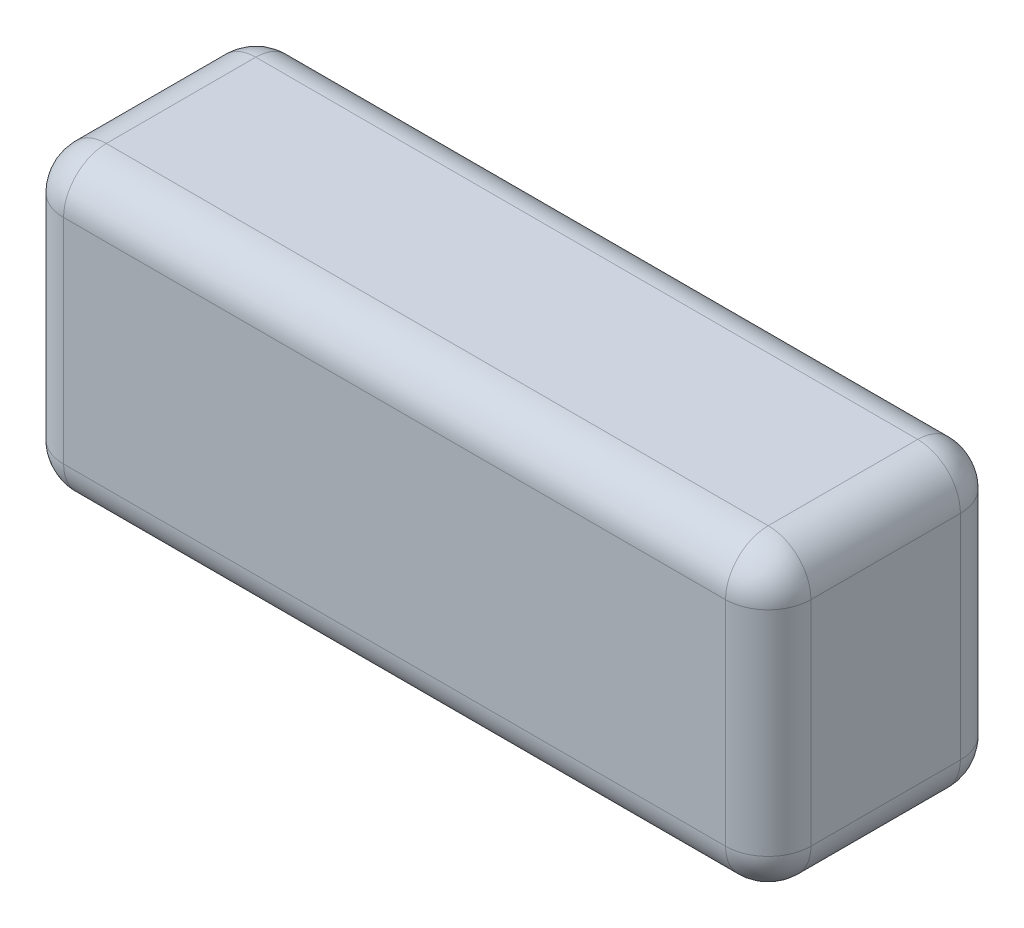
ISO-10303-21;
HEADER;
FILE_DESCRIPTION(('STEP AP214'),'2;1');
FILE_NAME('part.step','',(''),(''),'','','');
FILE_SCHEMA(('AUTOMOTIVE_DESIGN { 1 0 10303 214 1 1 1 1 }'));
ENDSEC;
DATA;
#1=APPLICATION_CONTEXT('core data for automotive mechanical design processes');
#2=APPLICATION_PROTOCOL_DEFINITION('international standard','automotive_design',2000,#1);
#3=PRODUCT_CONTEXT('',#1,'mechanical');
#4=PRODUCT('Part','Part','',(#3));
#5=PRODUCT_RELATED_PRODUCT_CATEGORY('part','',(#4));
#6=PRODUCT_DEFINITION_FORMATION('','',#4);
#7=PRODUCT_DEFINITION_CONTEXT('part definition',#1,'design');
#8=PRODUCT_DEFINITION('design','',#6,#7);
#9=PRODUCT_DEFINITION_SHAPE('','',#8);
#10=(LENGTH_UNIT() NAMED_UNIT(*) SI_UNIT(.MILLI.,.METRE.));
#11=(NAMED_UNIT(*) PLANE_ANGLE_UNIT() SI_UNIT($,.RADIAN.));
#12=(NAMED_UNIT(*) SI_UNIT($,.STERADIAN.) SOLID_ANGLE_UNIT());
#13=UNCERTAINTY_MEASURE_WITH_UNIT(LENGTH_MEASURE(1.E-05),#10,'distance_accuracy_value','');
#14=(GEOMETRIC_REPRESENTATION_CONTEXT(3) GLOBAL_UNCERTAINTY_ASSIGNED_CONTEXT((#13)) GLOBAL_UNIT_ASSIGNED_CONTEXT((#10,
#11,#12)) REPRESENTATION_CONTEXT('',''));
#15=CARTESIAN_POINT('',(0.,0.,0.));
#16=DIRECTION('',(0.,0.,1.));
#17=DIRECTION('',(1.,0.,0.));
#18=AXIS2_PLACEMENT_3D('',#15,#16,#17);
#19=CARTESIAN_POINT('',(70.,56.,-22.));
#20=DIRECTION('',(-1.,0.,0.));
#21=DIRECTION('',(0.,0.,1.));
#22=AXIS2_PLACEMENT_3D('',#19,#20,#21);
#23=PLANE('',#22);
#24=DIRECTION('',(0.,0.,-1.));
#25=VECTOR('',#24,1.);
#26=CARTESIAN_POINT('',(70.,48.,22.));
#27=LINE('',#26,#25);
#28=CARTESIAN_POINT('',(70.,48.,-14.));
#29=VERTEX_POINT('',#28);
#30=CARTESIAN_POINT('',(70.,48.,14.));
#31=VERTEX_POINT('',#30);
#32=EDGE_CURVE('E57',#29,#31,#27,.F.);
#33=ORIENTED_EDGE('',*,*,#32,.T.);
#34=DIRECTION('',(0.,-1.,0.));
#35=VECTOR('',#34,1.);
#36=CARTESIAN_POINT('',(70.,56.,14.));
#37=LINE('',#36,#35);
#38=CARTESIAN_POINT('',(70.,8.,14.));
#39=VERTEX_POINT('',#38);
#40=EDGE_CURVE('E50',#31,#39,#37,.T.);
#41=ORIENTED_EDGE('',*,*,#40,.T.);
#42=DIRECTION('',(0.,0.,-1.));
#43=VECTOR('',#42,1.);
#44=CARTESIAN_POINT('',(70.,8.,-22.));
#45=LINE('',#44,#43);
#46=CARTESIAN_POINT('',(70.,8.,-14.));
#47=VERTEX_POINT('',#46);
#48=EDGE_CURVE('E227',#39,#47,#45,.T.);
#49=ORIENTED_EDGE('',*,*,#48,.T.);
#50=DIRECTION('',(0.,-1.,0.));
#51=VECTOR('',#50,1.);
#52=CARTESIAN_POINT('',(70.,56.,-14.));
#53=LINE('',#52,#51);
#54=EDGE_CURVE('E62',#47,#29,#53,.F.);
#55=ORIENTED_EDGE('',*,*,#54,.T.);
#56=EDGE_LOOP('',(#33,#41,#49,#55));
#57=FACE_BOUND('',#56,.T.);
#58=ADVANCED_FACE('F41',(#57),#23,.F.);
#59=CARTESIAN_POINT('',(-70.,56.,-22.));
#60=DIRECTION('',(0.,0.,1.));
#61=DIRECTION('',(1.,0.,0.));
#62=AXIS2_PLACEMENT_3D('',#59,#60,#61);
#63=PLANE('',#62);
#64=CARTESIAN_POINT('',(0.,28.,-22.));
#65=DIRECTION('',(0.,0.,1.));
#66=DIRECTION('',(1.,0.,0.));
#67=AXIS2_PLACEMENT_3D('',#64,#65,#66);
#68=CIRCLE('',#67,0.907650606218853);
#69=CARTESIAN_POINT('',(0.907650606218874,28.,-22.));
#70=VERTEX_POINT('',#69);
#71=EDGE_CURVE('E11',#70,#70,#68,.F.);
#72=ORIENTED_EDGE('',*,*,#71,.F.);
#73=EDGE_LOOP('',(#72));
#74=FACE_BOUND('',#73,.T.);
#75=DIRECTION('',(-1.,0.,0.));
#76=VECTOR('',#75,1.);
#77=CARTESIAN_POINT('',(-70.,8.,-22.));
#78=LINE('',#77,#76);
#79=CARTESIAN_POINT('',(62.0000000000001,8.,-22.));
#80=VERTEX_POINT('',#79);
#81=CARTESIAN_POINT('',(-62.,8.,-22.));
#82=VERTEX_POINT('',#81);
#83=EDGE_CURVE('E204',#80,#82,#78,.T.);
#84=ORIENTED_EDGE('',*,*,#83,.T.);
#85=DIRECTION('',(0.,-1.,0.));
#86=VECTOR('',#85,1.);
#87=CARTESIAN_POINT('',(-62.,56.,-22.));
#88=LINE('',#87,#86);
#89=CARTESIAN_POINT('',(-62.,48.,-22.));
#90=VERTEX_POINT('',#89);
#91=EDGE_CURVE('E211',#82,#90,#88,.F.);
#92=ORIENTED_EDGE('',*,*,#91,.T.);
#93=DIRECTION('',(-1.,0.,0.));
#94=VECTOR('',#93,1.);
#95=CARTESIAN_POINT('',(70.,48.,-22.));
#96=LINE('',#95,#94);
#97=CARTESIAN_POINT('',(62.0000000000001,48.,-22.));
#98=VERTEX_POINT('',#97);
#99=EDGE_CURVE('E207',#90,#98,#96,.F.);
#100=ORIENTED_EDGE('',*,*,#99,.T.);
#101=DIRECTION('',(0.,-1.,0.));
#102=VECTOR('',#101,1.);
#103=CARTESIAN_POINT('',(62.0000000000001,56.,-22.));
#104=LINE('',#103,#102);
#105=EDGE_CURVE('E201',#98,#80,#104,.T.);
#106=ORIENTED_EDGE('',*,*,#105,.T.);
#107=EDGE_LOOP('',(#84,#92,#100,#106));
#108=FACE_BOUND('',#107,.T.);
#109=ADVANCED_FACE('F374',(#74,#108),#63,.F.);
#110=CARTESIAN_POINT('',(-70.,56.,-22.));
#111=DIRECTION('',(1.,0.,0.));
#112=DIRECTION('',(0.,0.,-1.));
#113=AXIS2_PLACEMENT_3D('',#110,#111,#112);
#114=PLANE('',#113);
#115=DIRECTION('',(0.,0.,1.));
#116=VECTOR('',#115,1.);
#117=CARTESIAN_POINT('',(-70.,48.,-22.));
#118=LINE('',#117,#116);
#119=CARTESIAN_POINT('',(-70.,48.,14.));
#120=VERTEX_POINT('',#119);
#121=CARTESIAN_POINT('',(-70.,48.,-14.));
#122=VERTEX_POINT('',#121);
#123=EDGE_CURVE('E220',#120,#122,#118,.F.);
#124=ORIENTED_EDGE('',*,*,#123,.T.);
#125=DIRECTION('',(0.,-1.,0.));
#126=VECTOR('',#125,1.);
#127=CARTESIAN_POINT('',(-70.,56.,-14.));
#128=LINE('',#127,#126);
#129=CARTESIAN_POINT('',(-70.,8.,-14.));
#130=VERTEX_POINT('',#129);
#131=EDGE_CURVE('E223',#122,#130,#128,.T.);
#132=ORIENTED_EDGE('',*,*,#131,.T.);
#133=DIRECTION('',(0.,0.,1.));
#134=VECTOR('',#133,1.);
#135=CARTESIAN_POINT('',(-70.,8.,-22.));
#136=LINE('',#135,#134);
#137=CARTESIAN_POINT('',(-70.,8.,14.));
#138=VERTEX_POINT('',#137);
#139=EDGE_CURVE('E214',#130,#138,#136,.T.);
#140=ORIENTED_EDGE('',*,*,#139,.T.);
#141=DIRECTION('',(0.,-1.,0.));
#142=VECTOR('',#141,1.);
#143=CARTESIAN_POINT('',(-70.,56.,14.));
#144=LINE('',#143,#142);
#145=EDGE_CURVE('E217',#138,#120,#144,.F.);
#146=ORIENTED_EDGE('',*,*,#145,.T.);
#147=EDGE_LOOP('',(#124,#132,#140,#146));
#148=FACE_BOUND('',#147,.T.);
#149=ADVANCED_FACE('F326',(#148),#114,.F.);
#150=CARTESIAN_POINT('',(-70.,56.,22.));
#151=DIRECTION('',(0.,0.,-1.));
#152=DIRECTION('',(-1.,0.,0.));
#153=AXIS2_PLACEMENT_3D('',#150,#151,#152);
#154=PLANE('',#153);
#155=DIRECTION('',(1.,0.,0.));
#156=VECTOR('',#155,1.);
#157=CARTESIAN_POINT('',(-70.,48.,22.));
#158=LINE('',#157,#156);
#159=CARTESIAN_POINT('',(62.,48.,22.));
#160=VERTEX_POINT('',#159);
#161=CARTESIAN_POINT('',(-62.,48.,22.));
#162=VERTEX_POINT('',#161);
#163=EDGE_CURVE('E138',#160,#162,#158,.F.);
#164=ORIENTED_EDGE('',*,*,#163,.T.);
#165=DIRECTION('',(0.,-1.,0.));
#166=VECTOR('',#165,1.);
#167=CARTESIAN_POINT('',(-62.,56.,22.));
#168=LINE('',#167,#166);
#169=CARTESIAN_POINT('',(-62.,8.,22.));
#170=VERTEX_POINT('',#169);
#171=EDGE_CURVE('E185',#162,#170,#168,.T.);
#172=ORIENTED_EDGE('',*,*,#171,.T.);
#173=DIRECTION('',(1.,0.,0.));
#174=VECTOR('',#173,1.);
#175=CARTESIAN_POINT('',(-70.,8.,22.));
#176=LINE('',#175,#174);
#177=CARTESIAN_POINT('',(62.,8.,22.));
#178=VERTEX_POINT('',#177);
#179=EDGE_CURVE('E180',#170,#178,#176,.T.);
#180=ORIENTED_EDGE('',*,*,#179,.T.);
#181=DIRECTION('',(0.,-1.,0.));
#182=VECTOR('',#181,1.);
#183=CARTESIAN_POINT('',(62.,56.,22.));
#184=LINE('',#183,#182);
#185=EDGE_CURVE('E174',#178,#160,#184,.F.);
#186=ORIENTED_EDGE('',*,*,#185,.T.);
#187=EDGE_LOOP('',(#164,#172,#180,#186));
#188=FACE_BOUND('',#187,.T.);
#189=ADVANCED_FACE('F348',(#188),#154,.F.);
#190=CARTESIAN_POINT('',(0.,56.,0.));
#191=DIRECTION('',(0.,1.,0.));
#192=DIRECTION('',(0.,0.,1.));
#193=AXIS2_PLACEMENT_3D('',#190,#191,#192);
#194=PLANE('',#193);
#195=DIRECTION('',(-1.,0.,0.));
#196=VECTOR('',#195,1.);
#197=CARTESIAN_POINT('',(-70.,56.,-14.));
#198=LINE('',#197,#196);
#199=CARTESIAN_POINT('',(62.,56.,-14.));
#200=VERTEX_POINT('',#199);
#201=CARTESIAN_POINT('',(-62.,56.,-14.));
#202=VERTEX_POINT('',#201);
#203=EDGE_CURVE('E163',#200,#202,#198,.T.);
#204=ORIENTED_EDGE('',*,*,#203,.T.);
#205=DIRECTION('',(0.,0.,1.));
#206=VECTOR('',#205,1.);
#207=CARTESIAN_POINT('',(-62.,56.,22.));
#208=LINE('',#207,#206);
#209=CARTESIAN_POINT('',(-62.,56.,14.));
#210=VERTEX_POINT('',#209);
#211=EDGE_CURVE('E168',#202,#210,#208,.T.);
#212=ORIENTED_EDGE('',*,*,#211,.T.);
#213=DIRECTION('',(1.,0.,0.));
#214=VECTOR('',#213,1.);
#215=CARTESIAN_POINT('',(70.,56.,14.));
#216=LINE('',#215,#214);
#217=CARTESIAN_POINT('',(62.,56.,14.));
#218=VERTEX_POINT('',#217);
#219=EDGE_CURVE('E136',#210,#218,#216,.T.);
#220=ORIENTED_EDGE('',*,*,#219,.T.);
#221=DIRECTION('',(0.,0.,-1.));
#222=VECTOR('',#221,1.);
#223=CARTESIAN_POINT('',(62.,56.,-22.));
#224=LINE('',#223,#222);
#225=EDGE_CURVE('E156',#218,#200,#224,.T.);
#226=ORIENTED_EDGE('',*,*,#225,.T.);
#227=EDGE_LOOP('',(#204,#212,#220,#226));
#228=FACE_BOUND('',#227,.T.);
#229=ADVANCED_FACE('F166',(#228),#194,.T.);
#230=CARTESIAN_POINT('',(0.,0.,0.));
#231=DIRECTION('',(0.,1.,0.));
#232=DIRECTION('',(0.,0.,1.));
#233=AXIS2_PLACEMENT_3D('',#230,#231,#232);
#234=PLANE('',#233);
#235=DIRECTION('',(1.,0.,0.));
#236=VECTOR('',#235,1.);
#237=CARTESIAN_POINT('',(0.,0.,14.));
#238=LINE('',#237,#236);
#239=CARTESIAN_POINT('',(62.,0.,14.));
#240=VERTEX_POINT('',#239);
#241=CARTESIAN_POINT('',(-62.,0.,14.));
#242=VERTEX_POINT('',#241);
#243=EDGE_CURVE('E194',#240,#242,#238,.F.);
#244=ORIENTED_EDGE('',*,*,#243,.T.);
#245=DIRECTION('',(0.,0.,1.));
#246=VECTOR('',#245,1.);
#247=CARTESIAN_POINT('',(-62.,0.,0.));
#248=LINE('',#247,#246);
#249=CARTESIAN_POINT('',(-62.,0.,-14.));
#250=VERTEX_POINT('',#249);
#251=EDGE_CURVE('E198',#242,#250,#248,.F.);
#252=ORIENTED_EDGE('',*,*,#251,.T.);
#253=DIRECTION('',(-1.,0.,0.));
#254=VECTOR('',#253,1.);
#255=CARTESIAN_POINT('',(0.,0.,-14.));
#256=LINE('',#255,#254);
#257=CARTESIAN_POINT('',(62.,0.,-14.));
#258=VERTEX_POINT('',#257);
#259=EDGE_CURVE('E191',#250,#258,#256,.F.);
#260=ORIENTED_EDGE('',*,*,#259,.T.);
#261=DIRECTION('',(0.,0.,-1.));
#262=VECTOR('',#261,1.);
#263=CARTESIAN_POINT('',(62.,0.,0.));
#264=LINE('',#263,#262);
#265=EDGE_CURVE('E188',#258,#240,#264,.F.);
#266=ORIENTED_EDGE('',*,*,#265,.T.);
#267=EDGE_LOOP('',(#244,#252,#260,#266));
#268=FACE_BOUND('',#267,.T.);
#269=ADVANCED_FACE('F376',(#268),#234,.F.);
#270=CARTESIAN_POINT('',(-70.,8.,-14.));
#271=DIRECTION('',(-1.,0.,0.));
#272=DIRECTION('',(0.,0.,1.));
#273=AXIS2_PLACEMENT_3D('',#270,#271,#272);
#274=CYLINDRICAL_SURFACE('',#273,8.);
#275=CARTESIAN_POINT('',(-62.,8.,-14.));
#276=DIRECTION('',(-1.,0.,0.));
#277=DIRECTION('',(0.,0.,1.));
#278=AXIS2_PLACEMENT_3D('',#275,#276,#277);
#279=CIRCLE('',#278,8.);
#280=EDGE_CURVE('E164',#82,#250,#279,.T.);
#281=ORIENTED_EDGE('',*,*,#280,.F.);
#282=ORIENTED_EDGE('',*,*,#83,.F.);
#283=CARTESIAN_POINT('',(62.,8.,-14.));
#284=DIRECTION('',(1.,0.,0.));
#285=DIRECTION('',(0.,0.,-1.));
#286=AXIS2_PLACEMENT_3D('',#283,#284,#285);
#287=CIRCLE('',#286,8.);
#288=EDGE_CURVE('E306',#258,#80,#287,.T.);
#289=ORIENTED_EDGE('',*,*,#288,.F.);
#290=ORIENTED_EDGE('',*,*,#259,.F.);
#291=EDGE_LOOP('',(#281,#282,#289,#290));
#292=FACE_BOUND('',#291,.T.);
#293=ADVANCED_FACE('F43',(#292),#274,.T.);
#294=CARTESIAN_POINT('',(-62.,8.,-14.));
#295=DIRECTION('',(0.,0.,1.));
#296=DIRECTION('',(1.,0.,0.));
#297=AXIS2_PLACEMENT_3D('',#294,#295,#296);
#298=SPHERICAL_SURFACE('',#297,8.);
#299=CARTESIAN_POINT('',(-62.,8.,-14.));
#300=DIRECTION('',(0.,-1.,0.));
#301=DIRECTION('',(0.,0.,-1.));
#302=AXIS2_PLACEMENT_3D('',#299,#300,#301);
#303=CIRCLE('',#302,8.);
#304=EDGE_CURVE('E298',#82,#130,#303,.F.);
#305=ORIENTED_EDGE('',*,*,#304,.F.);
#306=ORIENTED_EDGE('',*,*,#280,.T.);
#307=CARTESIAN_POINT('',(-62.,8.,-14.));
#308=DIRECTION('',(0.,0.,-1.));
#309=DIRECTION('',(-1.,0.,0.));
#310=AXIS2_PLACEMENT_3D('',#307,#308,#309);
#311=CIRCLE('',#310,8.);
#312=EDGE_CURVE('E302',#130,#250,#311,.F.);
#313=ORIENTED_EDGE('',*,*,#312,.F.);
#314=EDGE_LOOP('',(#305,#306,#313));
#315=FACE_BOUND('',#314,.T.);
#316=ADVANCED_FACE('F315',(#315),#298,.T.);
#317=CARTESIAN_POINT('',(62.,8.,-14.));
#318=DIRECTION('',(0.,0.,1.));
#319=DIRECTION('',(1.,0.,0.));
#320=AXIS2_PLACEMENT_3D('',#317,#318,#319);
#321=SPHERICAL_SURFACE('',#320,8.);
#322=CARTESIAN_POINT('',(62.,8.,-14.));
#323=DIRECTION('',(0.,0.,-1.));
#324=DIRECTION('',(-1.,0.,0.));
#325=AXIS2_PLACEMENT_3D('',#322,#323,#324);
#326=CIRCLE('',#325,8.);
#327=EDGE_CURVE('E290',#258,#47,#326,.F.);
#328=ORIENTED_EDGE('',*,*,#327,.F.);
#329=ORIENTED_EDGE('',*,*,#288,.T.);
#330=CARTESIAN_POINT('',(62.0000000000001,8.,-14.));
#331=DIRECTION('',(0.,-1.,0.));
#332=DIRECTION('',(0.,0.,-1.));
#333=AXIS2_PLACEMENT_3D('',#330,#331,#332);
#334=CIRCLE('',#333,8.);
#335=EDGE_CURVE('E294',#47,#80,#334,.F.);
#336=ORIENTED_EDGE('',*,*,#335,.F.);
#337=EDGE_LOOP('',(#328,#329,#336));
#338=FACE_BOUND('',#337,.T.);
#339=ADVANCED_FACE('F362',(#338),#321,.T.);
#340=CARTESIAN_POINT('',(-62.,8.,-22.));
#341=DIRECTION('',(0.,0.,1.));
#342=DIRECTION('',(1.,0.,0.));
#343=AXIS2_PLACEMENT_3D('',#340,#341,#342);
#344=CYLINDRICAL_SURFACE('',#343,8.);
#345=ORIENTED_EDGE('',*,*,#312,.T.);
#346=ORIENTED_EDGE('',*,*,#251,.F.);
#347=CARTESIAN_POINT('',(-62.,8.,14.));
#348=DIRECTION('',(0.,0.,1.));
#349=DIRECTION('',(1.,0.,0.));
#350=AXIS2_PLACEMENT_3D('',#347,#348,#349);
#351=CIRCLE('',#350,8.);
#352=EDGE_CURVE('E283',#138,#242,#351,.T.);
#353=ORIENTED_EDGE('',*,*,#352,.F.);
#354=ORIENTED_EDGE('',*,*,#139,.F.);
#355=EDGE_LOOP('',(#345,#346,#353,#354));
#356=FACE_BOUND('',#355,.T.);
#357=ADVANCED_FACE('F322',(#356),#344,.T.);
#358=CARTESIAN_POINT('',(-62.,56.,-14.));
#359=DIRECTION('',(0.,-1.,0.));
#360=DIRECTION('',(0.,0.,-1.));
#361=AXIS2_PLACEMENT_3D('',#358,#359,#360);
#362=CYLINDRICAL_SURFACE('',#361,8.);
#363=ORIENTED_EDGE('',*,*,#304,.T.);
#364=ORIENTED_EDGE('',*,*,#131,.F.);
#365=CARTESIAN_POINT('',(-62.,48.,-14.));
#366=DIRECTION('',(0.,1.,0.));
#367=DIRECTION('',(0.,0.,1.));
#368=AXIS2_PLACEMENT_3D('',#365,#366,#367);
#369=CIRCLE('',#368,8.);
#370=EDGE_CURVE('E279',#90,#122,#369,.T.);
#371=ORIENTED_EDGE('',*,*,#370,.F.);
#372=ORIENTED_EDGE('',*,*,#91,.F.);
#373=EDGE_LOOP('',(#363,#364,#371,#372));
#374=FACE_BOUND('',#373,.T.);
#375=ADVANCED_FACE('F332',(#374),#362,.T.);
#376=CARTESIAN_POINT('',(0.,48.,-14.));
#377=DIRECTION('',(1.,0.,0.));
#378=DIRECTION('',(0.,0.,-1.));
#379=AXIS2_PLACEMENT_3D('',#376,#377,#378);
#380=CYLINDRICAL_SURFACE('',#379,8.);
#381=CARTESIAN_POINT('',(62.0000000000001,48.,-14.));
#382=DIRECTION('',(1.,0.,0.));
#383=DIRECTION('',(0.,1.,0.));
#384=AXIS2_PLACEMENT_3D('',#381,#382,#383);
#385=CIRCLE('',#384,8.);
#386=EDGE_CURVE('E271',#98,#200,#385,.T.);
#387=ORIENTED_EDGE('',*,*,#386,.F.);
#388=ORIENTED_EDGE('',*,*,#99,.F.);
#389=CARTESIAN_POINT('',(-62.,48.,-14.));
#390=DIRECTION('',(-1.,0.,0.));
#391=DIRECTION('',(0.,0.,1.));
#392=AXIS2_PLACEMENT_3D('',#389,#390,#391);
#393=CIRCLE('',#392,8.);
#394=EDGE_CURVE('E275',#202,#90,#393,.T.);
#395=ORIENTED_EDGE('',*,*,#394,.F.);
#396=ORIENTED_EDGE('',*,*,#203,.F.);
#397=EDGE_LOOP('',(#387,#388,#395,#396));
#398=FACE_BOUND('',#397,.T.);
#399=ADVANCED_FACE('F372',(#398),#380,.T.);
#400=CARTESIAN_POINT('',(62.0000000000001,56.,-14.));
#401=DIRECTION('',(0.,-1.,0.));
#402=DIRECTION('',(0.,0.,-1.));
#403=AXIS2_PLACEMENT_3D('',#400,#401,#402);
#404=CYLINDRICAL_SURFACE('',#403,8.);
#405=ORIENTED_EDGE('',*,*,#335,.T.);
#406=ORIENTED_EDGE('',*,*,#105,.F.);
#407=CARTESIAN_POINT('',(62.,48.,-14.));
#408=DIRECTION('',(0.,1.,0.));
#409=DIRECTION('',(0.,0.,1.));
#410=AXIS2_PLACEMENT_3D('',#407,#408,#409);
#411=CIRCLE('',#410,8.);
#412=EDGE_CURVE('E268',#29,#98,#411,.T.);
#413=ORIENTED_EDGE('',*,*,#412,.F.);
#414=ORIENTED_EDGE('',*,*,#54,.F.);
#415=EDGE_LOOP('',(#405,#406,#413,#414));
#416=FACE_BOUND('',#415,.T.);
#417=ADVANCED_FACE('F366',(#416),#404,.T.);
#418=CARTESIAN_POINT('',(62.,8.,-22.));
#419=DIRECTION('',(0.,0.,-1.));
#420=DIRECTION('',(-1.,0.,0.));
#421=AXIS2_PLACEMENT_3D('',#418,#419,#420);
#422=CYLINDRICAL_SURFACE('',#421,8.);
#423=ORIENTED_EDGE('',*,*,#327,.T.);
#424=ORIENTED_EDGE('',*,*,#48,.F.);
#425=CARTESIAN_POINT('',(62.,8.,14.));
#426=DIRECTION('',(0.,0.,1.));
#427=DIRECTION('',(1.,0.,0.));
#428=AXIS2_PLACEMENT_3D('',#425,#426,#427);
#429=CIRCLE('',#428,8.);
#430=EDGE_CURVE('E264',#240,#39,#429,.T.);
#431=ORIENTED_EDGE('',*,*,#430,.F.);
#432=ORIENTED_EDGE('',*,*,#265,.F.);
#433=EDGE_LOOP('',(#423,#424,#431,#432));
#434=FACE_BOUND('',#433,.T.);
#435=ADVANCED_FACE('F360',(#434),#422,.T.);
#436=CARTESIAN_POINT('',(-70.,8.,14.));
#437=DIRECTION('',(1.,0.,0.));
#438=DIRECTION('',(0.,0.,-1.));
#439=AXIS2_PLACEMENT_3D('',#436,#437,#438);
#440=CYLINDRICAL_SURFACE('',#439,8.);
#441=CARTESIAN_POINT('',(-62.,8.,14.));
#442=DIRECTION('',(-1.,0.,0.));
#443=DIRECTION('',(0.,0.,1.));
#444=AXIS2_PLACEMENT_3D('',#441,#442,#443);
#445=CIRCLE('',#444,8.);
#446=EDGE_CURVE('E286',#242,#170,#445,.T.);
#447=ORIENTED_EDGE('',*,*,#446,.F.);
#448=ORIENTED_EDGE('',*,*,#243,.F.);
#449=CARTESIAN_POINT('',(62.,8.,14.));
#450=DIRECTION('',(1.,0.,0.));
#451=DIRECTION('',(0.,0.,-1.));
#452=AXIS2_PLACEMENT_3D('',#449,#450,#451);
#453=CIRCLE('',#452,8.);
#454=EDGE_CURVE('E260',#178,#240,#453,.T.);
#455=ORIENTED_EDGE('',*,*,#454,.F.);
#456=ORIENTED_EDGE('',*,*,#179,.F.);
#457=EDGE_LOOP('',(#447,#448,#455,#456));
#458=FACE_BOUND('',#457,.T.);
#459=ADVANCED_FACE('F380',(#458),#440,.T.);
#460=CARTESIAN_POINT('',(-62.,8.,14.));
#461=DIRECTION('',(0.,0.,1.));
#462=DIRECTION('',(1.,0.,0.));
#463=AXIS2_PLACEMENT_3D('',#460,#461,#462);
#464=SPHERICAL_SURFACE('',#463,8.);
#465=ORIENTED_EDGE('',*,*,#352,.T.);
#466=ORIENTED_EDGE('',*,*,#446,.T.);
#467=CARTESIAN_POINT('',(-62.,8.,14.));
#468=DIRECTION('',(0.,-1.,0.));
#469=DIRECTION('',(0.,0.,-1.));
#470=AXIS2_PLACEMENT_3D('',#467,#468,#469);
#471=CIRCLE('',#470,8.);
#472=EDGE_CURVE('E256',#138,#170,#471,.F.);
#473=ORIENTED_EDGE('',*,*,#472,.F.);
#474=EDGE_LOOP('',(#465,#466,#473));
#475=FACE_BOUND('',#474,.T.);
#476=ADVANCED_FACE('F489',(#475),#464,.T.);
#477=CARTESIAN_POINT('',(-62.,48.,-14.));
#478=DIRECTION('',(0.,0.,1.));
#479=DIRECTION('',(1.,0.,0.));
#480=AXIS2_PLACEMENT_3D('',#477,#478,#479);
#481=SPHERICAL_SURFACE('',#480,8.);
#482=ORIENTED_EDGE('',*,*,#394,.T.);
#483=ORIENTED_EDGE('',*,*,#370,.T.);
#484=CARTESIAN_POINT('',(-62.,48.,-14.));
#485=DIRECTION('',(0.,0.,-1.));
#486=DIRECTION('',(-1.,0.,0.));
#487=AXIS2_PLACEMENT_3D('',#484,#485,#486);
#488=CIRCLE('',#487,8.);
#489=EDGE_CURVE('E252',#202,#122,#488,.F.);
#490=ORIENTED_EDGE('',*,*,#489,.F.);
#491=EDGE_LOOP('',(#482,#483,#490));
#492=FACE_BOUND('',#491,.T.);
#493=ADVANCED_FACE('F335',(#492),#481,.T.);
#494=CARTESIAN_POINT('',(62.,48.,-14.));
#495=DIRECTION('',(0.,0.,1.));
#496=DIRECTION('',(1.,0.,0.));
#497=AXIS2_PLACEMENT_3D('',#494,#495,#496);
#498=SPHERICAL_SURFACE('',#497,8.);
#499=ORIENTED_EDGE('',*,*,#412,.T.);
#500=ORIENTED_EDGE('',*,*,#386,.T.);
#501=CARTESIAN_POINT('',(62.,48.,-14.));
#502=DIRECTION('',(0.,0.,-1.));
#503=DIRECTION('',(-1.,0.,0.));
#504=AXIS2_PLACEMENT_3D('',#501,#502,#503);
#505=CIRCLE('',#504,8.);
#506=EDGE_CURVE('E159',#29,#200,#505,.F.);
#507=ORIENTED_EDGE('',*,*,#506,.F.);
#508=EDGE_LOOP('',(#499,#500,#507));
#509=FACE_BOUND('',#508,.T.);
#510=ADVANCED_FACE('F369',(#509),#498,.T.);
#511=CARTESIAN_POINT('',(62.,8.,14.));
#512=DIRECTION('',(0.,0.,1.));
#513=DIRECTION('',(1.,0.,0.));
#514=AXIS2_PLACEMENT_3D('',#511,#512,#513);
#515=SPHERICAL_SURFACE('',#514,8.);
#516=ORIENTED_EDGE('',*,*,#454,.T.);
#517=ORIENTED_EDGE('',*,*,#430,.T.);
#518=CARTESIAN_POINT('',(62.,8.,14.));
#519=DIRECTION('',(0.,-1.,0.));
#520=DIRECTION('',(0.,0.,-1.));
#521=AXIS2_PLACEMENT_3D('',#518,#519,#520);
#522=CIRCLE('',#521,8.);
#523=EDGE_CURVE('E247',#178,#39,#522,.F.);
#524=ORIENTED_EDGE('',*,*,#523,.F.);
#525=EDGE_LOOP('',(#516,#517,#524));
#526=FACE_BOUND('',#525,.T.);
#527=ADVANCED_FACE('F382',(#526),#515,.T.);
#528=CARTESIAN_POINT('',(-62.,56.,14.));
#529=DIRECTION('',(0.,-1.,0.));
#530=DIRECTION('',(0.,0.,-1.));
#531=AXIS2_PLACEMENT_3D('',#528,#529,#530);
#532=CYLINDRICAL_SURFACE('',#531,8.);
#533=ORIENTED_EDGE('',*,*,#472,.T.);
#534=ORIENTED_EDGE('',*,*,#171,.F.);
#535=CARTESIAN_POINT('',(-62.,48.,14.));
#536=DIRECTION('',(0.,1.,0.));
#537=DIRECTION('',(0.,0.,1.));
#538=AXIS2_PLACEMENT_3D('',#535,#536,#537);
#539=CIRCLE('',#538,8.);
#540=EDGE_CURVE('E243',#120,#162,#539,.T.);
#541=ORIENTED_EDGE('',*,*,#540,.F.);
#542=ORIENTED_EDGE('',*,*,#145,.F.);
#543=EDGE_LOOP('',(#533,#534,#541,#542));
#544=FACE_BOUND('',#543,.T.);
#545=ADVANCED_FACE('F345',(#544),#532,.T.);
#546=CARTESIAN_POINT('',(-62.,48.,0.));
#547=DIRECTION('',(0.,0.,-1.));
#548=DIRECTION('',(-1.,0.,0.));
#549=AXIS2_PLACEMENT_3D('',#546,#547,#548);
#550=CYLINDRICAL_SURFACE('',#549,8.);
#551=ORIENTED_EDGE('',*,*,#489,.T.);
#552=ORIENTED_EDGE('',*,*,#123,.F.);
#553=CARTESIAN_POINT('',(-62.,48.,14.));
#554=DIRECTION('',(0.,0.,1.));
#555=DIRECTION('',(1.,0.,0.));
#556=AXIS2_PLACEMENT_3D('',#553,#554,#555);
#557=CIRCLE('',#556,8.);
#558=EDGE_CURVE('E153',#210,#120,#557,.T.);
#559=ORIENTED_EDGE('',*,*,#558,.F.);
#560=ORIENTED_EDGE('',*,*,#211,.F.);
#561=EDGE_LOOP('',(#551,#552,#559,#560));
#562=FACE_BOUND('',#561,.T.);
#563=ADVANCED_FACE('F338',(#562),#550,.T.);
#564=CARTESIAN_POINT('',(62.,48.,0.));
#565=DIRECTION('',(0.,0.,1.));
#566=DIRECTION('',(1.,0.,0.));
#567=AXIS2_PLACEMENT_3D('',#564,#565,#566);
#568=CYLINDRICAL_SURFACE('',#567,8.);
#569=ORIENTED_EDGE('',*,*,#506,.T.);
#570=ORIENTED_EDGE('',*,*,#225,.F.);
#571=CARTESIAN_POINT('',(62.,48.,14.));
#572=DIRECTION('',(0.,0.,1.));
#573=DIRECTION('',(0.,-1.,0.));
#574=AXIS2_PLACEMENT_3D('',#571,#572,#573);
#575=CIRCLE('',#574,8.);
#576=EDGE_CURVE('E146',#31,#218,#575,.T.);
#577=ORIENTED_EDGE('',*,*,#576,.F.);
#578=ORIENTED_EDGE('',*,*,#32,.F.);
#579=EDGE_LOOP('',(#569,#570,#577,#578));
#580=FACE_BOUND('',#579,.T.);
#581=ADVANCED_FACE('F157',(#580),#568,.T.);
#582=CARTESIAN_POINT('',(62.,56.,14.));
#583=DIRECTION('',(0.,-1.,0.));
#584=DIRECTION('',(0.,0.,-1.));
#585=AXIS2_PLACEMENT_3D('',#582,#583,#584);
#586=CYLINDRICAL_SURFACE('',#585,8.);
#587=ORIENTED_EDGE('',*,*,#523,.T.);
#588=ORIENTED_EDGE('',*,*,#40,.F.);
#589=CARTESIAN_POINT('',(62.,48.,14.));
#590=DIRECTION('',(0.,1.,0.));
#591=DIRECTION('',(0.,0.,1.));
#592=AXIS2_PLACEMENT_3D('',#589,#590,#591);
#593=CIRCLE('',#592,8.);
#594=EDGE_CURVE('E150',#160,#31,#593,.T.);
#595=ORIENTED_EDGE('',*,*,#594,.F.);
#596=ORIENTED_EDGE('',*,*,#185,.F.);
#597=EDGE_LOOP('',(#587,#588,#595,#596));
#598=FACE_BOUND('',#597,.T.);
#599=ADVANCED_FACE('F352',(#598),#586,.T.);
#600=CARTESIAN_POINT('',(-62.,48.,14.));
#601=DIRECTION('',(0.,0.,1.));
#602=DIRECTION('',(1.,0.,0.));
#603=AXIS2_PLACEMENT_3D('',#600,#601,#602);
#604=SPHERICAL_SURFACE('',#603,8.);
#605=ORIENTED_EDGE('',*,*,#558,.T.);
#606=ORIENTED_EDGE('',*,*,#540,.T.);
#607=CARTESIAN_POINT('',(-62.,48.,14.));
#608=DIRECTION('',(-1.,0.,0.));
#609=DIRECTION('',(0.,0.,1.));
#610=AXIS2_PLACEMENT_3D('',#607,#608,#609);
#611=CIRCLE('',#610,8.);
#612=EDGE_CURVE('E142',#210,#162,#611,.F.);
#613=ORIENTED_EDGE('',*,*,#612,.F.);
#614=EDGE_LOOP('',(#605,#606,#613));
#615=FACE_BOUND('',#614,.T.);
#616=ADVANCED_FACE('F342',(#615),#604,.T.);
#617=CARTESIAN_POINT('',(62.,48.,14.));
#618=DIRECTION('',(0.,0.,1.));
#619=DIRECTION('',(1.,0.,0.));
#620=AXIS2_PLACEMENT_3D('',#617,#618,#619);
#621=SPHERICAL_SURFACE('',#620,8.);
#622=ORIENTED_EDGE('',*,*,#594,.T.);
#623=ORIENTED_EDGE('',*,*,#576,.T.);
#624=CARTESIAN_POINT('',(62.,48.,14.));
#625=DIRECTION('',(1.,0.,0.));
#626=DIRECTION('',(0.,0.,-1.));
#627=AXIS2_PLACEMENT_3D('',#624,#625,#626);
#628=CIRCLE('',#627,8.);
#629=EDGE_CURVE('E132',#160,#218,#628,.F.);
#630=ORIENTED_EDGE('',*,*,#629,.F.);
#631=EDGE_LOOP('',(#622,#623,#630));
#632=FACE_BOUND('',#631,.T.);
#633=ADVANCED_FACE('F148',(#632),#621,.T.);
#634=CARTESIAN_POINT('',(0.,48.,14.));
#635=DIRECTION('',(-1.,0.,0.));
#636=DIRECTION('',(0.,0.,1.));
#637=AXIS2_PLACEMENT_3D('',#634,#635,#636);
#638=CYLINDRICAL_SURFACE('',#637,8.);
#639=ORIENTED_EDGE('',*,*,#612,.T.);
#640=ORIENTED_EDGE('',*,*,#163,.F.);
#641=ORIENTED_EDGE('',*,*,#629,.T.);
#642=ORIENTED_EDGE('',*,*,#219,.F.);
#643=EDGE_LOOP('',(#639,#640,#641,#642));
#644=FACE_BOUND('',#643,.T.);
#645=ADVANCED_FACE('F134',(#644),#638,.T.);
#646=CARTESIAN_POINT('',(0.,28.,-23.));
#647=DIRECTION('',(0.,0.,1.));
#648=DIRECTION('',(1.,0.,0.));
#649=AXIS2_PLACEMENT_3D('',#646,#647,#648);
#650=CYLINDRICAL_SURFACE('',#649,0.907650606218853);
#651=CARTESIAN_POINT('',(0.,28.,-23.));
#652=DIRECTION('',(0.,0.,-1.));
#653=DIRECTION('',(-1.,0.,0.));
#654=AXIS2_PLACEMENT_3D('',#651,#652,#653);
#655=CIRCLE('',#654,0.907650606218853);
#656=CARTESIAN_POINT('',(-0.907650606218832,28.,-23.));
#657=VERTEX_POINT('',#656);
#658=EDGE_CURVE('E143',#657,#657,#655,.T.);
#659=ORIENTED_EDGE('',*,*,#658,.F.);
#660=EDGE_LOOP('',(#659));
#661=FACE_BOUND('',#660,.T.);
#662=ORIENTED_EDGE('',*,*,#71,.T.);
#663=EDGE_LOOP('',(#662));
#664=FACE_BOUND('',#663,.T.);
#665=ADVANCED_FACE('F403',(#661,#664),#650,.T.);
#666=CARTESIAN_POINT('',(0.,28.,-23.));
#667=DIRECTION('',(0.,0.,-1.));
#668=DIRECTION('',(-1.,0.,0.));
#669=AXIS2_PLACEMENT_3D('',#666,#667,#668);
#670=PLANE('',#669);
#671=ORIENTED_EDGE('',*,*,#658,.T.);
#672=EDGE_LOOP('',(#671));
#673=FACE_BOUND('',#672,.T.);
#674=ADVANCED_FACE('F443',(#673),#670,.T.);
#675=CLOSED_SHELL('',(#58,#109,#149,#189,#229,#269,#293,#316,#339,#357,#375,#399,#417,#435,#459,
#476,#493,#510,#527,#545,#563,#581,#599,#616,#633,#645,#665,#674));
#676=MANIFOLD_SOLID_BREP('B2',#675);
#677=ADVANCED_BREP_SHAPE_REPRESENTATION('',(#18,#676),#14);
#678=SHAPE_DEFINITION_REPRESENTATION(#9,#677);
ENDSEC;
END-ISO-10303-21;
